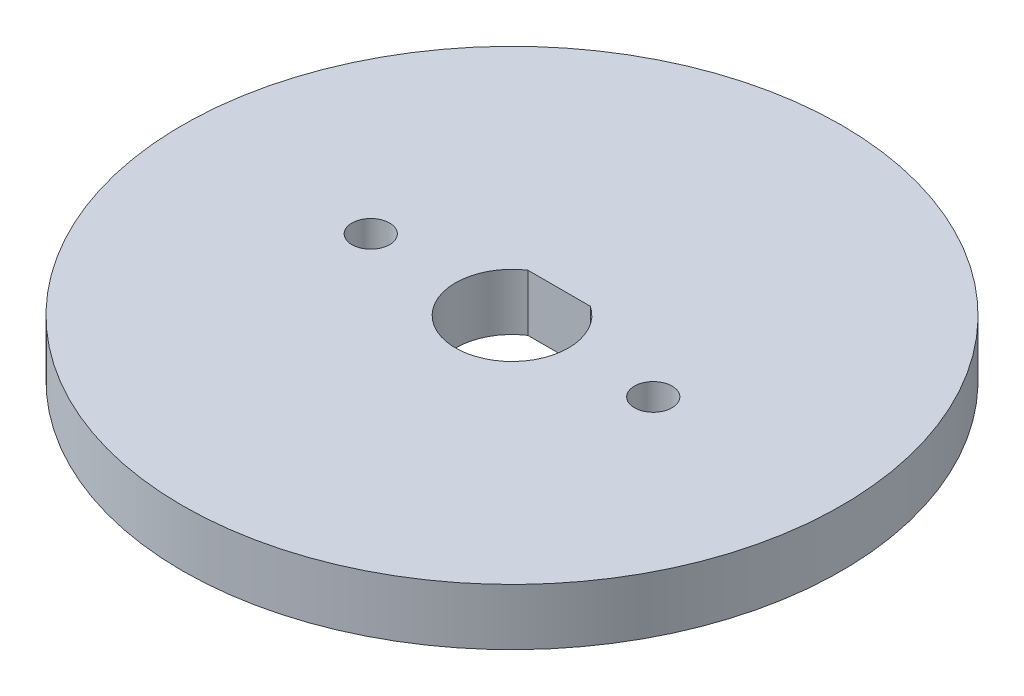
ISO-10303-21;
HEADER;
FILE_DESCRIPTION(('STEP AP214'),'2;1');
FILE_NAME('part.step','',(''),(''),'','','');
FILE_SCHEMA(('AUTOMOTIVE_DESIGN { 1 0 10303 214 1 1 1 1 }'));
ENDSEC;
DATA;
#1=APPLICATION_CONTEXT('core data for automotive mechanical design processes');
#2=APPLICATION_PROTOCOL_DEFINITION('international standard','automotive_design',2000,#1);
#3=PRODUCT_CONTEXT('',#1,'mechanical');
#4=PRODUCT('Part','Part','',(#3));
#5=PRODUCT_RELATED_PRODUCT_CATEGORY('part','',(#4));
#6=PRODUCT_DEFINITION_FORMATION('','',#4);
#7=PRODUCT_DEFINITION_CONTEXT('part definition',#1,'design');
#8=PRODUCT_DEFINITION('design','',#6,#7);
#9=PRODUCT_DEFINITION_SHAPE('','',#8);
#10=(LENGTH_UNIT() NAMED_UNIT(*) SI_UNIT(.MILLI.,.METRE.));
#11=(NAMED_UNIT(*) PLANE_ANGLE_UNIT() SI_UNIT($,.RADIAN.));
#12=(NAMED_UNIT(*) SI_UNIT($,.STERADIAN.) SOLID_ANGLE_UNIT());
#13=UNCERTAINTY_MEASURE_WITH_UNIT(LENGTH_MEASURE(1.E-05),#10,'distance_accuracy_value','');
#14=(GEOMETRIC_REPRESENTATION_CONTEXT(3) GLOBAL_UNCERTAINTY_ASSIGNED_CONTEXT((#13)) GLOBAL_UNIT_ASSIGNED_CONTEXT((#10,
#11,#12)) REPRESENTATION_CONTEXT('',''));
#15=CARTESIAN_POINT('',(0.,0.,0.));
#16=DIRECTION('',(0.,0.,1.));
#17=DIRECTION('',(1.,0.,0.));
#18=AXIS2_PLACEMENT_3D('',#15,#16,#17);
#19=CARTESIAN_POINT('',(0.,3.,0.));
#20=DIRECTION('',(0.,-1.,0.));
#21=DIRECTION('',(0.,0.,-1.));
#22=AXIS2_PLACEMENT_3D('',#19,#20,#21);
#23=CYLINDRICAL_SURFACE('',#22,17.5);
#24=CARTESIAN_POINT('',(0.,3.,0.));
#25=DIRECTION('',(0.,1.,0.));
#26=DIRECTION('',(0.,0.,1.));
#27=AXIS2_PLACEMENT_3D('',#24,#25,#26);
#28=CIRCLE('',#27,17.5);
#29=CARTESIAN_POINT('',(0.,3.,17.5));
#30=VERTEX_POINT('',#29);
#31=EDGE_CURVE('E11',#30,#30,#28,.T.);
#32=ORIENTED_EDGE('',*,*,#31,.F.);
#33=EDGE_LOOP('',(#32));
#34=FACE_BOUND('',#33,.T.);
#35=CARTESIAN_POINT('',(0.,0.,0.));
#36=DIRECTION('',(0.,1.,0.));
#37=DIRECTION('',(0.,0.,1.));
#38=AXIS2_PLACEMENT_3D('',#35,#36,#37);
#39=CIRCLE('',#38,17.5);
#40=CARTESIAN_POINT('',(0.,0.,17.5));
#41=VERTEX_POINT('',#40);
#42=EDGE_CURVE('E36',#41,#41,#39,.T.);
#43=ORIENTED_EDGE('',*,*,#42,.T.);
#44=EDGE_LOOP('',(#43));
#45=FACE_BOUND('',#44,.T.);
#46=ADVANCED_FACE('F33',(#34,#45),#23,.T.);
#47=CARTESIAN_POINT('',(0.,3.,0.));
#48=DIRECTION('',(0.,1.,0.));
#49=DIRECTION('',(0.,0.,1.));
#50=AXIS2_PLACEMENT_3D('',#47,#48,#49);
#51=PLANE('',#50);
#52=CARTESIAN_POINT('',(-7.5,3.,0.));
#53=DIRECTION('',(0.,1.,0.));
#54=DIRECTION('',(0.,0.,1.));
#55=AXIS2_PLACEMENT_3D('',#52,#53,#54);
#56=CIRCLE('',#55,1.);
#57=CARTESIAN_POINT('',(-7.5,3.,1.));
#58=VERTEX_POINT('',#57);
#59=EDGE_CURVE('E75',#58,#58,#56,.T.);
#60=ORIENTED_EDGE('',*,*,#59,.F.);
#61=EDGE_LOOP('',(#60));
#62=FACE_BOUND('',#61,.T.);
#63=CARTESIAN_POINT('',(7.5,3.,0.));
#64=DIRECTION('',(0.,1.,0.));
#65=DIRECTION('',(0.,0.,1.));
#66=AXIS2_PLACEMENT_3D('',#63,#64,#65);
#67=CIRCLE('',#66,1.);
#68=CARTESIAN_POINT('',(7.5,3.,0.999999999999999));
#69=VERTEX_POINT('',#68);
#70=EDGE_CURVE('E83',#69,#69,#67,.T.);
#71=ORIENTED_EDGE('',*,*,#70,.F.);
#72=EDGE_LOOP('',(#71));
#73=FACE_BOUND('',#72,.T.);
#74=CARTESIAN_POINT('',(0.,3.,0.));
#75=DIRECTION('',(0.,1.,0.));
#76=DIRECTION('',(0.,0.,1.));
#77=AXIS2_PLACEMENT_3D('',#74,#75,#76);
#78=CIRCLE('',#77,3.);
#79=CARTESIAN_POINT('',(-1.6583123951777,3.,-2.5));
#80=VERTEX_POINT('',#79);
#81=CARTESIAN_POINT('',(1.6583123951777,3.,-2.5));
#82=VERTEX_POINT('',#81);
#83=EDGE_CURVE('E47',#80,#82,#78,.T.);
#84=ORIENTED_EDGE('',*,*,#83,.F.);
#85=DIRECTION('',(-1.,0.,0.));
#86=VECTOR('',#85,1.);
#87=CARTESIAN_POINT('',(-1.6583123951777,3.,-2.5));
#88=LINE('',#87,#86);
#89=EDGE_CURVE('E66',#82,#80,#88,.T.);
#90=ORIENTED_EDGE('',*,*,#89,.F.);
#91=EDGE_LOOP('',(#84,#90));
#92=FACE_BOUND('',#91,.T.);
#93=ORIENTED_EDGE('',*,*,#31,.T.);
#94=EDGE_LOOP('',(#93));
#95=FACE_BOUND('',#94,.T.);
#96=ADVANCED_FACE('F70',(#62,#73,#92,#95),#51,.T.);
#97=CARTESIAN_POINT('',(0.,0.,0.));
#98=DIRECTION('',(0.,1.,0.));
#99=DIRECTION('',(0.,0.,1.));
#100=AXIS2_PLACEMENT_3D('',#97,#98,#99);
#101=PLANE('',#100);
#102=CARTESIAN_POINT('',(-7.5,0.,0.));
#103=DIRECTION('',(0.,1.,0.));
#104=DIRECTION('',(0.,0.,1.));
#105=AXIS2_PLACEMENT_3D('',#102,#103,#104);
#106=CIRCLE('',#105,1.);
#107=CARTESIAN_POINT('',(-7.5,0.,1.));
#108=VERTEX_POINT('',#107);
#109=EDGE_CURVE('E72',#108,#108,#106,.T.);
#110=ORIENTED_EDGE('',*,*,#109,.T.);
#111=EDGE_LOOP('',(#110));
#112=FACE_BOUND('',#111,.T.);
#113=CARTESIAN_POINT('',(7.5,0.,0.));
#114=DIRECTION('',(0.,1.,0.));
#115=DIRECTION('',(0.,0.,1.));
#116=AXIS2_PLACEMENT_3D('',#113,#114,#115);
#117=CIRCLE('',#116,1.);
#118=CARTESIAN_POINT('',(7.5,0.,0.999999999999999));
#119=VERTEX_POINT('',#118);
#120=EDGE_CURVE('E86',#119,#119,#117,.T.);
#121=ORIENTED_EDGE('',*,*,#120,.T.);
#122=EDGE_LOOP('',(#121));
#123=FACE_BOUND('',#122,.T.);
#124=DIRECTION('',(-1.,0.,0.));
#125=VECTOR('',#124,1.);
#126=CARTESIAN_POINT('',(-1.6583123951777,0.,-2.5));
#127=LINE('',#126,#125);
#128=CARTESIAN_POINT('',(1.6583123951777,0.,-2.5));
#129=VERTEX_POINT('',#128);
#130=CARTESIAN_POINT('',(-1.6583123951777,0.,-2.5));
#131=VERTEX_POINT('',#130);
#132=EDGE_CURVE('E78',#129,#131,#127,.T.);
#133=ORIENTED_EDGE('',*,*,#132,.T.);
#134=CARTESIAN_POINT('',(0.,0.,0.));
#135=DIRECTION('',(0.,1.,0.));
#136=DIRECTION('',(0.,0.,1.));
#137=AXIS2_PLACEMENT_3D('',#134,#135,#136);
#138=CIRCLE('',#137,3.);
#139=EDGE_CURVE('E52',#131,#129,#138,.T.);
#140=ORIENTED_EDGE('',*,*,#139,.T.);
#141=EDGE_LOOP('',(#133,#140));
#142=FACE_BOUND('',#141,.T.);
#143=ORIENTED_EDGE('',*,*,#42,.F.);
#144=EDGE_LOOP('',(#143));
#145=FACE_BOUND('',#144,.T.);
#146=ADVANCED_FACE('F96',(#112,#123,#142,#145),#101,.F.);
#147=CARTESIAN_POINT('',(0.,0.,0.));
#148=DIRECTION('',(0.,1.,0.));
#149=DIRECTION('',(0.,0.,1.));
#150=AXIS2_PLACEMENT_3D('',#147,#148,#149);
#151=CYLINDRICAL_SURFACE('',#150,3.);
#152=ORIENTED_EDGE('',*,*,#83,.T.);
#153=DIRECTION('',(0.,1.,0.));
#154=VECTOR('',#153,1.);
#155=CARTESIAN_POINT('',(1.6583123951777,0.,-2.5));
#156=LINE('',#155,#154);
#157=EDGE_CURVE('E63',#129,#82,#156,.T.);
#158=ORIENTED_EDGE('',*,*,#157,.F.);
#159=ORIENTED_EDGE('',*,*,#139,.F.);
#160=DIRECTION('',(0.,1.,0.));
#161=VECTOR('',#160,1.);
#162=CARTESIAN_POINT('',(-1.6583123951777,0.,-2.5));
#163=LINE('',#162,#161);
#164=EDGE_CURVE('E57',#131,#80,#163,.T.);
#165=ORIENTED_EDGE('',*,*,#164,.T.);
#166=EDGE_LOOP('',(#152,#158,#159,#165));
#167=FACE_BOUND('',#166,.T.);
#168=ADVANCED_FACE('F59',(#167),#151,.F.);
#169=CARTESIAN_POINT('',(-1.6583123951777,0.,-2.5));
#170=DIRECTION('',(0.,0.,-1.));
#171=DIRECTION('',(-1.,0.,0.));
#172=AXIS2_PLACEMENT_3D('',#169,#170,#171);
#173=PLANE('',#172);
#174=ORIENTED_EDGE('',*,*,#89,.T.);
#175=ORIENTED_EDGE('',*,*,#164,.F.);
#176=ORIENTED_EDGE('',*,*,#132,.F.);
#177=ORIENTED_EDGE('',*,*,#157,.T.);
#178=EDGE_LOOP('',(#174,#175,#176,#177));
#179=FACE_BOUND('',#178,.T.);
#180=ADVANCED_FACE('F67',(#179),#173,.F.);
#181=CARTESIAN_POINT('',(7.5,0.,0.));
#182=DIRECTION('',(0.,1.,0.));
#183=DIRECTION('',(0.,0.,1.));
#184=AXIS2_PLACEMENT_3D('',#181,#182,#183);
#185=CYLINDRICAL_SURFACE('',#184,1.);
#186=ORIENTED_EDGE('',*,*,#120,.F.);
#187=EDGE_LOOP('',(#186));
#188=FACE_BOUND('',#187,.T.);
#189=ORIENTED_EDGE('',*,*,#70,.T.);
#190=EDGE_LOOP('',(#189));
#191=FACE_BOUND('',#190,.T.);
#192=ADVANCED_FACE('F100',(#188,#191),#185,.F.);
#193=CARTESIAN_POINT('',(-7.5,0.,0.));
#194=DIRECTION('',(0.,1.,0.));
#195=DIRECTION('',(0.,0.,1.));
#196=AXIS2_PLACEMENT_3D('',#193,#194,#195);
#197=CYLINDRICAL_SURFACE('',#196,1.);
#198=ORIENTED_EDGE('',*,*,#109,.F.);
#199=EDGE_LOOP('',(#198));
#200=FACE_BOUND('',#199,.T.);
#201=ORIENTED_EDGE('',*,*,#59,.T.);
#202=EDGE_LOOP('',(#201));
#203=FACE_BOUND('',#202,.T.);
#204=ADVANCED_FACE('F92',(#200,#203),#197,.F.);
#205=CLOSED_SHELL('',(#46,#96,#146,#168,#180,#192,#204));
#206=MANIFOLD_SOLID_BREP('B2',#205);
#207=ADVANCED_BREP_SHAPE_REPRESENTATION('',(#18,#206),#14);
#208=SHAPE_DEFINITION_REPRESENTATION(#9,#207);
ENDSEC;
END-ISO-10303-21;
